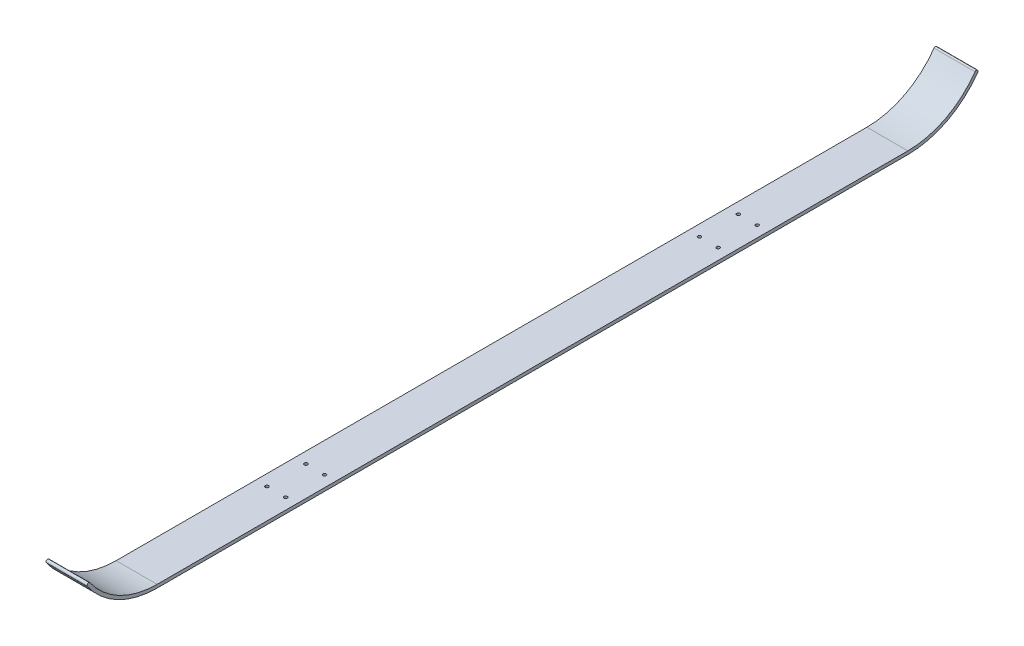
ISO-10303-21;
HEADER;
FILE_DESCRIPTION(('STEP AP214'),'2;1');
FILE_NAME('part.step','',(''),(''),'','','');
FILE_SCHEMA(('AUTOMOTIVE_DESIGN { 1 0 10303 214 1 1 1 1 }'));
ENDSEC;
DATA;
#1=APPLICATION_CONTEXT('core data for automotive mechanical design processes');
#2=APPLICATION_PROTOCOL_DEFINITION('international standard','automotive_design',2000,#1);
#3=PRODUCT_CONTEXT('',#1,'mechanical');
#4=PRODUCT('Part','Part','',(#3));
#5=PRODUCT_RELATED_PRODUCT_CATEGORY('part','',(#4));
#6=PRODUCT_DEFINITION_FORMATION('','',#4);
#7=PRODUCT_DEFINITION_CONTEXT('part definition',#1,'design');
#8=PRODUCT_DEFINITION('design','',#6,#7);
#9=PRODUCT_DEFINITION_SHAPE('','',#8);
#10=(LENGTH_UNIT() NAMED_UNIT(*) SI_UNIT(.MILLI.,.METRE.));
#11=(NAMED_UNIT(*) PLANE_ANGLE_UNIT() SI_UNIT($,.RADIAN.));
#12=(NAMED_UNIT(*) SI_UNIT($,.STERADIAN.) SOLID_ANGLE_UNIT());
#13=UNCERTAINTY_MEASURE_WITH_UNIT(LENGTH_MEASURE(1.E-05),#10,'distance_accuracy_value','');
#14=(GEOMETRIC_REPRESENTATION_CONTEXT(3) GLOBAL_UNCERTAINTY_ASSIGNED_CONTEXT((#13)) GLOBAL_UNIT_ASSIGNED_CONTEXT((#10,
#11,#12)) REPRESENTATION_CONTEXT('',''));
#15=CARTESIAN_POINT('',(0.,0.,0.));
#16=DIRECTION('',(0.,0.,1.));
#17=DIRECTION('',(1.,0.,0.));
#18=AXIS2_PLACEMENT_3D('',#15,#16,#17);
#19=CARTESIAN_POINT('',(0.,12.,0.));
#20=DIRECTION('',(0.,-1.,0.));
#21=DIRECTION('',(0.,0.,-1.));
#22=AXIS2_PLACEMENT_3D('',#19,#20,#21);
#23=PLANE('',#22);
#24=DIRECTION('',(0.,0.,-1.));
#25=VECTOR('',#24,1.);
#26=CARTESIAN_POINT('',(75.,12.,1274.));
#27=LINE('',#26,#25);
#28=CARTESIAN_POINT('',(75.,12.,1374.));
#29=VERTEX_POINT('',#28);
#30=CARTESIAN_POINT('',(75.,12.,-1374.));
#31=VERTEX_POINT('',#30);
#32=EDGE_CURVE('E41',#29,#31,#27,.T.);
#33=ORIENTED_EDGE('',*,*,#32,.T.);
#34=DIRECTION('',(1.,0.,0.));
#35=VECTOR('',#34,1.);
#36=CARTESIAN_POINT('',(-459.068847578424,12.,-1374.));
#37=LINE('',#36,#35);
#38=CARTESIAN_POINT('',(-75.,12.,-1374.));
#39=VERTEX_POINT('',#38);
#40=EDGE_CURVE('E108',#39,#31,#37,.T.);
#41=ORIENTED_EDGE('',*,*,#40,.F.);
#42=DIRECTION('',(0.,0.,1.));
#43=VECTOR('',#42,1.);
#44=CARTESIAN_POINT('',(-75.,12.,1274.));
#45=LINE('',#44,#43);
#46=CARTESIAN_POINT('',(-75.,12.,1374.));
#47=VERTEX_POINT('',#46);
#48=EDGE_CURVE('E11',#39,#47,#45,.T.);
#49=ORIENTED_EDGE('',*,*,#48,.T.);
#50=DIRECTION('',(1.,0.,0.));
#51=VECTOR('',#50,1.);
#52=CARTESIAN_POINT('',(-459.068847578424,12.,1374.));
#53=LINE('',#52,#51);
#54=EDGE_CURVE('E148',#47,#29,#53,.T.);
#55=ORIENTED_EDGE('',*,*,#54,.T.);
#56=EDGE_LOOP('',(#33,#41,#49,#55));
#57=FACE_BOUND('',#56,.T.);
#58=CARTESIAN_POINT('',(-34.2499999999996,12.,-720.25));
#59=DIRECTION('',(0.,1.,0.));
#60=DIRECTION('',(0.,0.,1.));
#61=AXIS2_PLACEMENT_3D('',#58,#59,#60);
#62=CIRCLE('',#61,6.);
#63=CARTESIAN_POINT('',(-34.2499999999996,12.,-714.25));
#64=VERTEX_POINT('',#63);
#65=EDGE_CURVE('E199',#64,#64,#62,.T.);
#66=ORIENTED_EDGE('',*,*,#65,.F.);
#67=EDGE_LOOP('',(#66));
#68=FACE_BOUND('',#67,.T.);
#69=CARTESIAN_POINT('',(34.2500000000004,12.,-720.25));
#70=DIRECTION('',(0.,1.,0.));
#71=DIRECTION('',(0.,0.,1.));
#72=AXIS2_PLACEMENT_3D('',#69,#70,#71);
#73=CIRCLE('',#72,6.);
#74=CARTESIAN_POINT('',(34.2500000000004,12.,-714.25));
#75=VERTEX_POINT('',#74);
#76=EDGE_CURVE('E193',#75,#75,#73,.T.);
#77=ORIENTED_EDGE('',*,*,#76,.F.);
#78=EDGE_LOOP('',(#77));
#79=FACE_BOUND('',#78,.T.);
#80=CARTESIAN_POINT('',(-34.2499999999996,12.,-862.75));
#81=DIRECTION('',(0.,1.,0.));
#82=DIRECTION('',(0.,0.,1.));
#83=AXIS2_PLACEMENT_3D('',#80,#81,#82);
#84=CIRCLE('',#83,6.);
#85=CARTESIAN_POINT('',(-34.2499999999996,12.,-856.75));
#86=VERTEX_POINT('',#85);
#87=EDGE_CURVE('E187',#86,#86,#84,.T.);
#88=ORIENTED_EDGE('',*,*,#87,.F.);
#89=EDGE_LOOP('',(#88));
#90=FACE_BOUND('',#89,.T.);
#91=CARTESIAN_POINT('',(34.2500000000004,12.,-862.75));
#92=DIRECTION('',(0.,1.,0.));
#93=DIRECTION('',(0.,0.,1.));
#94=AXIS2_PLACEMENT_3D('',#91,#92,#93);
#95=CIRCLE('',#94,6.);
#96=CARTESIAN_POINT('',(34.2500000000004,12.,-856.75));
#97=VERTEX_POINT('',#96);
#98=EDGE_CURVE('E181',#97,#97,#95,.T.);
#99=ORIENTED_EDGE('',*,*,#98,.F.);
#100=EDGE_LOOP('',(#99));
#101=FACE_BOUND('',#100,.T.);
#102=CARTESIAN_POINT('',(34.2500000000004,12.,720.25));
#103=DIRECTION('',(0.,1.,0.));
#104=DIRECTION('',(0.,0.,-1.));
#105=AXIS2_PLACEMENT_3D('',#102,#103,#104);
#106=CIRCLE('',#105,6.);
#107=CARTESIAN_POINT('',(34.2500000000004,12.,714.25));
#108=VERTEX_POINT('',#107);
#109=EDGE_CURVE('E175',#108,#108,#106,.T.);
#110=ORIENTED_EDGE('',*,*,#109,.F.);
#111=EDGE_LOOP('',(#110));
#112=FACE_BOUND('',#111,.T.);
#113=CARTESIAN_POINT('',(-34.2499999999996,12.,720.25));
#114=DIRECTION('',(0.,1.,0.));
#115=DIRECTION('',(0.,0.,-1.));
#116=AXIS2_PLACEMENT_3D('',#113,#114,#115);
#117=CIRCLE('',#116,6.);
#118=CARTESIAN_POINT('',(-34.2499999999996,12.,714.25));
#119=VERTEX_POINT('',#118);
#120=EDGE_CURVE('E169',#119,#119,#117,.T.);
#121=ORIENTED_EDGE('',*,*,#120,.F.);
#122=EDGE_LOOP('',(#121));
#123=FACE_BOUND('',#122,.T.);
#124=CARTESIAN_POINT('',(34.2500000000004,12.,862.75));
#125=DIRECTION('',(0.,1.,0.));
#126=DIRECTION('',(0.,0.,-1.));
#127=AXIS2_PLACEMENT_3D('',#124,#125,#126);
#128=CIRCLE('',#127,6.);
#129=CARTESIAN_POINT('',(34.2500000000004,12.,856.75));
#130=VERTEX_POINT('',#129);
#131=EDGE_CURVE('E163',#130,#130,#128,.T.);
#132=ORIENTED_EDGE('',*,*,#131,.F.);
#133=EDGE_LOOP('',(#132));
#134=FACE_BOUND('',#133,.T.);
#135=CARTESIAN_POINT('',(-34.2499999999996,12.,862.75));
#136=DIRECTION('',(0.,1.,0.));
#137=DIRECTION('',(0.,0.,-1.));
#138=AXIS2_PLACEMENT_3D('',#135,#136,#137);
#139=CIRCLE('',#138,6.);
#140=CARTESIAN_POINT('',(-34.2499999999996,12.,856.75));
#141=VERTEX_POINT('',#140);
#142=EDGE_CURVE('E157',#141,#141,#139,.T.);
#143=ORIENTED_EDGE('',*,*,#142,.F.);
#144=EDGE_LOOP('',(#143));
#145=FACE_BOUND('',#144,.T.);
#146=ADVANCED_FACE('F32',(#57,#68,#79,#90,#101,#112,#123,#134,#145),#23,.F.);
#147=CARTESIAN_POINT('',(0.,0.,0.));
#148=DIRECTION('',(0.,-1.,0.));
#149=DIRECTION('',(0.,0.,-1.));
#150=AXIS2_PLACEMENT_3D('',#147,#148,#149);
#151=PLANE('',#150);
#152=CARTESIAN_POINT('',(34.2500000000004,0.,862.75));
#153=DIRECTION('',(0.,1.,0.));
#154=DIRECTION('',(0.,0.,-1.));
#155=AXIS2_PLACEMENT_3D('',#152,#153,#154);
#156=CIRCLE('',#155,6.);
#157=CARTESIAN_POINT('',(34.2500000000004,0.,856.75));
#158=VERTEX_POINT('',#157);
#159=EDGE_CURVE('E160',#158,#158,#156,.T.);
#160=ORIENTED_EDGE('',*,*,#159,.T.);
#161=EDGE_LOOP('',(#160));
#162=FACE_BOUND('',#161,.T.);
#163=CARTESIAN_POINT('',(34.2500000000004,0.,720.25));
#164=DIRECTION('',(0.,1.,0.));
#165=DIRECTION('',(0.,0.,-1.));
#166=AXIS2_PLACEMENT_3D('',#163,#164,#165);
#167=CIRCLE('',#166,6.);
#168=CARTESIAN_POINT('',(34.2500000000004,0.,714.25));
#169=VERTEX_POINT('',#168);
#170=EDGE_CURVE('E172',#169,#169,#167,.T.);
#171=ORIENTED_EDGE('',*,*,#170,.T.);
#172=EDGE_LOOP('',(#171));
#173=FACE_BOUND('',#172,.T.);
#174=CARTESIAN_POINT('',(-34.2499999999996,0.,-862.75));
#175=DIRECTION('',(0.,1.,0.));
#176=DIRECTION('',(0.,0.,1.));
#177=AXIS2_PLACEMENT_3D('',#174,#175,#176);
#178=CIRCLE('',#177,6.);
#179=CARTESIAN_POINT('',(-34.2499999999996,0.,-856.75));
#180=VERTEX_POINT('',#179);
#181=EDGE_CURVE('E184',#180,#180,#178,.T.);
#182=ORIENTED_EDGE('',*,*,#181,.T.);
#183=EDGE_LOOP('',(#182));
#184=FACE_BOUND('',#183,.T.);
#185=CARTESIAN_POINT('',(-34.2499999999996,0.,-720.25));
#186=DIRECTION('',(0.,1.,0.));
#187=DIRECTION('',(0.,0.,1.));
#188=AXIS2_PLACEMENT_3D('',#185,#186,#187);
#189=CIRCLE('',#188,6.);
#190=CARTESIAN_POINT('',(-34.2499999999996,0.,-714.25));
#191=VERTEX_POINT('',#190);
#192=EDGE_CURVE('E196',#191,#191,#189,.T.);
#193=ORIENTED_EDGE('',*,*,#192,.T.);
#194=EDGE_LOOP('',(#193));
#195=FACE_BOUND('',#194,.T.);
#196=DIRECTION('',(0.,0.,-1.));
#197=VECTOR('',#196,1.);
#198=CARTESIAN_POINT('',(75.,0.,1274.));
#199=LINE('',#198,#197);
#200=CARTESIAN_POINT('',(75.,0.,1374.));
#201=VERTEX_POINT('',#200);
#202=CARTESIAN_POINT('',(75.,0.,-1374.));
#203=VERTEX_POINT('',#202);
#204=EDGE_CURVE('E202',#201,#203,#199,.T.);
#205=ORIENTED_EDGE('',*,*,#204,.F.);
#206=DIRECTION('',(1.,0.,0.));
#207=VECTOR('',#206,1.);
#208=CARTESIAN_POINT('',(-459.068847578424,0.,1374.));
#209=LINE('',#208,#207);
#210=CARTESIAN_POINT('',(-75.,0.,1374.));
#211=VERTEX_POINT('',#210);
#212=EDGE_CURVE('E136',#211,#201,#209,.T.);
#213=ORIENTED_EDGE('',*,*,#212,.F.);
#214=DIRECTION('',(0.,0.,1.));
#215=VECTOR('',#214,1.);
#216=CARTESIAN_POINT('',(-75.,0.,1274.));
#217=LINE('',#216,#215);
#218=CARTESIAN_POINT('',(-75.,0.,-1374.));
#219=VERTEX_POINT('',#218);
#220=EDGE_CURVE('E36',#219,#211,#217,.T.);
#221=ORIENTED_EDGE('',*,*,#220,.F.);
#222=DIRECTION('',(1.,0.,0.));
#223=VECTOR('',#222,1.);
#224=CARTESIAN_POINT('',(-459.068847578424,0.,-1374.));
#225=LINE('',#224,#223);
#226=EDGE_CURVE('E127',#219,#203,#225,.T.);
#227=ORIENTED_EDGE('',*,*,#226,.T.);
#228=EDGE_LOOP('',(#205,#213,#221,#227));
#229=FACE_BOUND('',#228,.T.);
#230=CARTESIAN_POINT('',(34.2500000000004,0.,-720.25));
#231=DIRECTION('',(0.,1.,0.));
#232=DIRECTION('',(0.,0.,1.));
#233=AXIS2_PLACEMENT_3D('',#230,#231,#232);
#234=CIRCLE('',#233,6.);
#235=CARTESIAN_POINT('',(34.2500000000004,0.,-714.25));
#236=VERTEX_POINT('',#235);
#237=EDGE_CURVE('E190',#236,#236,#234,.T.);
#238=ORIENTED_EDGE('',*,*,#237,.T.);
#239=EDGE_LOOP('',(#238));
#240=FACE_BOUND('',#239,.T.);
#241=CARTESIAN_POINT('',(34.2500000000004,0.,-862.75));
#242=DIRECTION('',(0.,1.,0.));
#243=DIRECTION('',(0.,0.,1.));
#244=AXIS2_PLACEMENT_3D('',#241,#242,#243);
#245=CIRCLE('',#244,6.);
#246=CARTESIAN_POINT('',(34.2500000000004,0.,-856.75));
#247=VERTEX_POINT('',#246);
#248=EDGE_CURVE('E178',#247,#247,#245,.T.);
#249=ORIENTED_EDGE('',*,*,#248,.T.);
#250=EDGE_LOOP('',(#249));
#251=FACE_BOUND('',#250,.T.);
#252=CARTESIAN_POINT('',(-34.2499999999996,0.,720.25));
#253=DIRECTION('',(0.,1.,0.));
#254=DIRECTION('',(0.,0.,-1.));
#255=AXIS2_PLACEMENT_3D('',#252,#253,#254);
#256=CIRCLE('',#255,6.);
#257=CARTESIAN_POINT('',(-34.2499999999996,0.,714.25));
#258=VERTEX_POINT('',#257);
#259=EDGE_CURVE('E166',#258,#258,#256,.T.);
#260=ORIENTED_EDGE('',*,*,#259,.T.);
#261=EDGE_LOOP('',(#260));
#262=FACE_BOUND('',#261,.T.);
#263=CARTESIAN_POINT('',(-34.2499999999996,0.,862.75));
#264=DIRECTION('',(0.,1.,0.));
#265=DIRECTION('',(0.,0.,-1.));
#266=AXIS2_PLACEMENT_3D('',#263,#264,#265);
#267=CIRCLE('',#266,6.);
#268=CARTESIAN_POINT('',(-34.2499999999996,0.,856.75));
#269=VERTEX_POINT('',#268);
#270=EDGE_CURVE('E139',#269,#269,#267,.T.);
#271=ORIENTED_EDGE('',*,*,#270,.T.);
#272=EDGE_LOOP('',(#271));
#273=FACE_BOUND('',#272,.T.);
#274=ADVANCED_FACE('F215',(#162,#173,#184,#195,#229,#240,#251,#262,#273),#151,.T.);
#275=CARTESIAN_POINT('',(75.,12.,1274.));
#276=DIRECTION('',(-1.,0.,0.));
#277=DIRECTION('',(0.,0.,1.));
#278=AXIS2_PLACEMENT_3D('',#275,#276,#277);
#279=PLANE('',#278);
#280=ORIENTED_EDGE('',*,*,#204,.T.);
#281=CARTESIAN_POINT('',(75.,312.,-1374.));
#282=DIRECTION('',(1.,0.,0.));
#283=DIRECTION('',(0.,0.,1.));
#284=AXIS2_PLACEMENT_3D('',#281,#282,#283);
#285=CIRCLE('',#284,312.);
#286=CARTESIAN_POINT('',(75.,133.044151858472,-1629.57543781816));
#287=VERTEX_POINT('',#286);
#288=EDGE_CURVE('E109',#203,#287,#285,.T.);
#289=ORIENTED_EDGE('',*,*,#288,.T.);
#290=CARTESIAN_POINT('',(75.,136.485610476578,-1624.66052555243));
#291=DIRECTION('',(1.,0.,0.));
#292=DIRECTION('',(0.,0.,1.));
#293=AXIS2_PLACEMENT_3D('',#290,#291,#292);
#294=CIRCLE('',#293,5.99999999999999);
#295=CARTESIAN_POINT('',(75.,139.927069094684,-1619.7456132867));
#296=VERTEX_POINT('',#295);
#297=EDGE_CURVE('E103',#287,#296,#294,.T.);
#298=ORIENTED_EDGE('',*,*,#297,.T.);
#299=CARTESIAN_POINT('',(75.,312.,-1374.));
#300=DIRECTION('',(-1.,0.,0.));
#301=DIRECTION('',(0.,0.,1.));
#302=AXIS2_PLACEMENT_3D('',#299,#300,#301);
#303=CIRCLE('',#302,300.);
#304=EDGE_CURVE('E113',#296,#31,#303,.T.);
#305=ORIENTED_EDGE('',*,*,#304,.T.);
#306=ORIENTED_EDGE('',*,*,#32,.F.);
#307=CARTESIAN_POINT('',(75.,312.,1374.));
#308=DIRECTION('',(-1.,0.,0.));
#309=DIRECTION('',(0.,0.,-1.));
#310=AXIS2_PLACEMENT_3D('',#307,#308,#309);
#311=CIRCLE('',#310,300.);
#312=CARTESIAN_POINT('',(75.,139.927069094684,1619.7456132867));
#313=VERTEX_POINT('',#312);
#314=EDGE_CURVE('E133',#29,#313,#311,.T.);
#315=ORIENTED_EDGE('',*,*,#314,.T.);
#316=CARTESIAN_POINT('',(75.,136.485610476578,1624.66052555243));
#317=DIRECTION('',(1.,0.,0.));
#318=DIRECTION('',(0.,0.,-1.));
#319=AXIS2_PLACEMENT_3D('',#316,#317,#318);
#320=CIRCLE('',#319,5.99999999999999);
#321=CARTESIAN_POINT('',(75.,133.044151858472,1629.57543781816));
#322=VERTEX_POINT('',#321);
#323=EDGE_CURVE('E142',#313,#322,#320,.T.);
#324=ORIENTED_EDGE('',*,*,#323,.T.);
#325=CARTESIAN_POINT('',(75.,312.,1374.));
#326=DIRECTION('',(1.,0.,0.));
#327=DIRECTION('',(0.,0.,-1.));
#328=AXIS2_PLACEMENT_3D('',#325,#326,#327);
#329=CIRCLE('',#328,312.);
#330=EDGE_CURVE('E145',#322,#201,#329,.T.);
#331=ORIENTED_EDGE('',*,*,#330,.T.);
#332=EDGE_LOOP('',(#280,#289,#298,#305,#306,#315,#324,#331));
#333=FACE_BOUND('',#332,.T.);
#334=ADVANCED_FACE('F34',(#333),#279,.F.);
#335=CARTESIAN_POINT('',(-75.,12.,1274.));
#336=DIRECTION('',(1.,0.,0.));
#337=DIRECTION('',(0.,0.,-1.));
#338=AXIS2_PLACEMENT_3D('',#335,#336,#337);
#339=PLANE('',#338);
#340=ORIENTED_EDGE('',*,*,#220,.T.);
#341=CARTESIAN_POINT('',(-75.,312.,1374.));
#342=DIRECTION('',(1.,0.,0.));
#343=DIRECTION('',(0.,0.,-1.));
#344=AXIS2_PLACEMENT_3D('',#341,#342,#343);
#345=CIRCLE('',#344,312.);
#346=CARTESIAN_POINT('',(-75.,133.044151858472,1629.57543781816));
#347=VERTEX_POINT('',#346);
#348=EDGE_CURVE('E54',#211,#347,#345,.F.);
#349=ORIENTED_EDGE('',*,*,#348,.T.);
#350=CARTESIAN_POINT('',(-75.,136.485610476578,1624.66052555243));
#351=DIRECTION('',(1.,0.,0.));
#352=DIRECTION('',(0.,0.,-1.));
#353=AXIS2_PLACEMENT_3D('',#350,#351,#352);
#354=CIRCLE('',#353,5.99999999999999);
#355=CARTESIAN_POINT('',(-75.,139.927069094684,1619.7456132867));
#356=VERTEX_POINT('',#355);
#357=EDGE_CURVE('E49',#347,#356,#354,.F.);
#358=ORIENTED_EDGE('',*,*,#357,.T.);
#359=CARTESIAN_POINT('',(-75.,312.,1374.));
#360=DIRECTION('',(1.,0.,0.));
#361=DIRECTION('',(0.,0.,-1.));
#362=AXIS2_PLACEMENT_3D('',#359,#360,#361);
#363=CIRCLE('',#362,300.);
#364=EDGE_CURVE('E134',#356,#47,#363,.T.);
#365=ORIENTED_EDGE('',*,*,#364,.T.);
#366=ORIENTED_EDGE('',*,*,#48,.F.);
#367=CARTESIAN_POINT('',(-75.,312.,-1374.));
#368=DIRECTION('',(1.,0.,0.));
#369=DIRECTION('',(0.,0.,-1.));
#370=AXIS2_PLACEMENT_3D('',#367,#368,#369);
#371=CIRCLE('',#370,300.);
#372=CARTESIAN_POINT('',(-75.,139.927069094684,-1619.7456132867));
#373=VERTEX_POINT('',#372);
#374=EDGE_CURVE('E131',#39,#373,#371,.T.);
#375=ORIENTED_EDGE('',*,*,#374,.T.);
#376=CARTESIAN_POINT('',(-75.,136.485610476578,-1624.66052555243));
#377=DIRECTION('',(1.,0.,0.));
#378=DIRECTION('',(0.,0.,-1.));
#379=AXIS2_PLACEMENT_3D('',#376,#377,#378);
#380=CIRCLE('',#379,5.99999999999999);
#381=CARTESIAN_POINT('',(-75.,133.044151858472,-1629.57543781816));
#382=VERTEX_POINT('',#381);
#383=EDGE_CURVE('E105',#373,#382,#380,.F.);
#384=ORIENTED_EDGE('',*,*,#383,.T.);
#385=CARTESIAN_POINT('',(-75.,312.,-1374.));
#386=DIRECTION('',(1.,0.,0.));
#387=DIRECTION('',(0.,0.,-1.));
#388=AXIS2_PLACEMENT_3D('',#385,#386,#387);
#389=CIRCLE('',#388,312.);
#390=EDGE_CURVE('E126',#382,#219,#389,.F.);
#391=ORIENTED_EDGE('',*,*,#390,.T.);
#392=EDGE_LOOP('',(#340,#349,#358,#365,#366,#375,#384,#391));
#393=FACE_BOUND('',#392,.T.);
#394=ADVANCED_FACE('F206',(#393),#339,.F.);
#395=CARTESIAN_POINT('',(-34.2499999999996,12.,-720.25));
#396=DIRECTION('',(0.,-1.,0.));
#397=DIRECTION('',(0.,0.,-1.));
#398=AXIS2_PLACEMENT_3D('',#395,#396,#397);
#399=CYLINDRICAL_SURFACE('',#398,6.);
#400=ORIENTED_EDGE('',*,*,#65,.T.);
#401=EDGE_LOOP('',(#400));
#402=FACE_BOUND('',#401,.T.);
#403=ORIENTED_EDGE('',*,*,#192,.F.);
#404=EDGE_LOOP('',(#403));
#405=FACE_BOUND('',#404,.T.);
#406=ADVANCED_FACE('F246',(#402,#405),#399,.F.);
#407=CARTESIAN_POINT('',(34.2500000000004,12.,-720.25));
#408=DIRECTION('',(0.,-1.,0.));
#409=DIRECTION('',(0.,0.,-1.));
#410=AXIS2_PLACEMENT_3D('',#407,#408,#409);
#411=CYLINDRICAL_SURFACE('',#410,6.);
#412=ORIENTED_EDGE('',*,*,#76,.T.);
#413=EDGE_LOOP('',(#412));
#414=FACE_BOUND('',#413,.T.);
#415=ORIENTED_EDGE('',*,*,#237,.F.);
#416=EDGE_LOOP('',(#415));
#417=FACE_BOUND('',#416,.T.);
#418=ADVANCED_FACE('F253',(#414,#417),#411,.F.);
#419=CARTESIAN_POINT('',(-34.2499999999996,12.,-862.75));
#420=DIRECTION('',(0.,-1.,0.));
#421=DIRECTION('',(0.,0.,-1.));
#422=AXIS2_PLACEMENT_3D('',#419,#420,#421);
#423=CYLINDRICAL_SURFACE('',#422,6.);
#424=ORIENTED_EDGE('',*,*,#87,.T.);
#425=EDGE_LOOP('',(#424));
#426=FACE_BOUND('',#425,.T.);
#427=ORIENTED_EDGE('',*,*,#181,.F.);
#428=EDGE_LOOP('',(#427));
#429=FACE_BOUND('',#428,.T.);
#430=ADVANCED_FACE('F317',(#426,#429),#423,.F.);
#431=CARTESIAN_POINT('',(34.2500000000004,12.,-862.75));
#432=DIRECTION('',(0.,-1.,0.));
#433=DIRECTION('',(0.,0.,-1.));
#434=AXIS2_PLACEMENT_3D('',#431,#432,#433);
#435=CYLINDRICAL_SURFACE('',#434,6.);
#436=ORIENTED_EDGE('',*,*,#98,.T.);
#437=EDGE_LOOP('',(#436));
#438=FACE_BOUND('',#437,.T.);
#439=ORIENTED_EDGE('',*,*,#248,.F.);
#440=EDGE_LOOP('',(#439));
#441=FACE_BOUND('',#440,.T.);
#442=ADVANCED_FACE('F307',(#438,#441),#435,.F.);
#443=CARTESIAN_POINT('',(34.2500000000004,12.,720.25));
#444=DIRECTION('',(0.,-1.,0.));
#445=DIRECTION('',(0.,0.,-1.));
#446=AXIS2_PLACEMENT_3D('',#443,#444,#445);
#447=CYLINDRICAL_SURFACE('',#446,6.);
#448=ORIENTED_EDGE('',*,*,#109,.T.);
#449=EDGE_LOOP('',(#448));
#450=FACE_BOUND('',#449,.T.);
#451=ORIENTED_EDGE('',*,*,#170,.F.);
#452=EDGE_LOOP('',(#451));
#453=FACE_BOUND('',#452,.T.);
#454=ADVANCED_FACE('F297',(#450,#453),#447,.F.);
#455=CARTESIAN_POINT('',(-34.2499999999996,12.,720.25));
#456=DIRECTION('',(0.,-1.,0.));
#457=DIRECTION('',(0.,0.,-1.));
#458=AXIS2_PLACEMENT_3D('',#455,#456,#457);
#459=CYLINDRICAL_SURFACE('',#458,6.);
#460=ORIENTED_EDGE('',*,*,#120,.T.);
#461=EDGE_LOOP('',(#460));
#462=FACE_BOUND('',#461,.T.);
#463=ORIENTED_EDGE('',*,*,#259,.F.);
#464=EDGE_LOOP('',(#463));
#465=FACE_BOUND('',#464,.T.);
#466=ADVANCED_FACE('F287',(#462,#465),#459,.F.);
#467=CARTESIAN_POINT('',(34.2500000000004,12.,862.75));
#468=DIRECTION('',(0.,-1.,0.));
#469=DIRECTION('',(0.,0.,-1.));
#470=AXIS2_PLACEMENT_3D('',#467,#468,#469);
#471=CYLINDRICAL_SURFACE('',#470,6.);
#472=ORIENTED_EDGE('',*,*,#131,.T.);
#473=EDGE_LOOP('',(#472));
#474=FACE_BOUND('',#473,.T.);
#475=ORIENTED_EDGE('',*,*,#159,.F.);
#476=EDGE_LOOP('',(#475));
#477=FACE_BOUND('',#476,.T.);
#478=ADVANCED_FACE('F277',(#474,#477),#471,.F.);
#479=CARTESIAN_POINT('',(-34.2499999999996,12.,862.75));
#480=DIRECTION('',(0.,-1.,0.));
#481=DIRECTION('',(0.,0.,-1.));
#482=AXIS2_PLACEMENT_3D('',#479,#480,#481);
#483=CYLINDRICAL_SURFACE('',#482,6.);
#484=ORIENTED_EDGE('',*,*,#142,.T.);
#485=EDGE_LOOP('',(#484));
#486=FACE_BOUND('',#485,.T.);
#487=ORIENTED_EDGE('',*,*,#270,.F.);
#488=EDGE_LOOP('',(#487));
#489=FACE_BOUND('',#488,.T.);
#490=ADVANCED_FACE('F236',(#486,#489),#483,.F.);
#491=CARTESIAN_POINT('',(-459.068847578424,312.,1374.));
#492=DIRECTION('',(1.,0.,0.));
#493=DIRECTION('',(0.,0.,-1.));
#494=AXIS2_PLACEMENT_3D('',#491,#492,#493);
#495=CYLINDRICAL_SURFACE('',#494,312.);
#496=ORIENTED_EDGE('',*,*,#348,.F.);
#497=ORIENTED_EDGE('',*,*,#212,.T.);
#498=ORIENTED_EDGE('',*,*,#330,.F.);
#499=DIRECTION('',(1.,0.,0.));
#500=VECTOR('',#499,1.);
#501=CARTESIAN_POINT('',(-459.068847578424,133.044151858472,1629.57543781816));
#502=LINE('',#501,#500);
#503=EDGE_CURVE('E151',#347,#322,#502,.T.);
#504=ORIENTED_EDGE('',*,*,#503,.F.);
#505=EDGE_LOOP('',(#496,#497,#498,#504));
#506=FACE_BOUND('',#505,.T.);
#507=ADVANCED_FACE('F213',(#506),#495,.T.);
#508=CARTESIAN_POINT('',(-459.068847578424,136.485610476578,1624.66052555243));
#509=DIRECTION('',(1.,0.,0.));
#510=DIRECTION('',(0.,0.,-1.));
#511=AXIS2_PLACEMENT_3D('',#508,#509,#510);
#512=CYLINDRICAL_SURFACE('',#511,5.99999999999999);
#513=ORIENTED_EDGE('',*,*,#357,.F.);
#514=ORIENTED_EDGE('',*,*,#503,.T.);
#515=ORIENTED_EDGE('',*,*,#323,.F.);
#516=DIRECTION('',(1.,0.,0.));
#517=VECTOR('',#516,1.);
#518=CARTESIAN_POINT('',(-459.068847578424,139.927069094684,1619.7456132867));
#519=LINE('',#518,#517);
#520=EDGE_CURVE('E153',#356,#313,#519,.T.);
#521=ORIENTED_EDGE('',*,*,#520,.F.);
#522=EDGE_LOOP('',(#513,#514,#515,#521));
#523=FACE_BOUND('',#522,.T.);
#524=ADVANCED_FACE('F228',(#523),#512,.T.);
#525=CARTESIAN_POINT('',(-459.068847578424,312.,1374.));
#526=DIRECTION('',(1.,0.,0.));
#527=DIRECTION('',(0.,0.,-1.));
#528=AXIS2_PLACEMENT_3D('',#525,#526,#527);
#529=CYLINDRICAL_SURFACE('',#528,300.);
#530=ORIENTED_EDGE('',*,*,#364,.F.);
#531=ORIENTED_EDGE('',*,*,#520,.T.);
#532=ORIENTED_EDGE('',*,*,#314,.F.);
#533=ORIENTED_EDGE('',*,*,#54,.F.);
#534=EDGE_LOOP('',(#530,#531,#532,#533));
#535=FACE_BOUND('',#534,.T.);
#536=ADVANCED_FACE('F225',(#535),#529,.F.);
#537=CARTESIAN_POINT('',(-459.068847578424,136.485610476578,-1624.66052555243));
#538=DIRECTION('',(1.,0.,0.));
#539=DIRECTION('',(0.,0.,-1.));
#540=AXIS2_PLACEMENT_3D('',#537,#538,#539);
#541=CYLINDRICAL_SURFACE('',#540,5.99999999999999);
#542=ORIENTED_EDGE('',*,*,#383,.F.);
#543=DIRECTION('',(1.,0.,0.));
#544=VECTOR('',#543,1.);
#545=CARTESIAN_POINT('',(-459.068847578424,139.927069094684,-1619.7456132867));
#546=LINE('',#545,#544);
#547=EDGE_CURVE('E98',#373,#296,#546,.T.);
#548=ORIENTED_EDGE('',*,*,#547,.T.);
#549=ORIENTED_EDGE('',*,*,#297,.F.);
#550=DIRECTION('',(1.,0.,0.));
#551=VECTOR('',#550,1.);
#552=CARTESIAN_POINT('',(-459.068847578424,133.044151858472,-1629.57543781816));
#553=LINE('',#552,#551);
#554=EDGE_CURVE('E124',#382,#287,#553,.T.);
#555=ORIENTED_EDGE('',*,*,#554,.F.);
#556=EDGE_LOOP('',(#542,#548,#549,#555));
#557=FACE_BOUND('',#556,.T.);
#558=ADVANCED_FACE('F100',(#557),#541,.T.);
#559=CARTESIAN_POINT('',(-459.068847578424,312.,-1374.));
#560=DIRECTION('',(1.,0.,0.));
#561=DIRECTION('',(0.,0.,-1.));
#562=AXIS2_PLACEMENT_3D('',#559,#560,#561);
#563=CYLINDRICAL_SURFACE('',#562,312.);
#564=ORIENTED_EDGE('',*,*,#390,.F.);
#565=ORIENTED_EDGE('',*,*,#554,.T.);
#566=ORIENTED_EDGE('',*,*,#288,.F.);
#567=ORIENTED_EDGE('',*,*,#226,.F.);
#568=EDGE_LOOP('',(#564,#565,#566,#567));
#569=FACE_BOUND('',#568,.T.);
#570=ADVANCED_FACE('F218',(#569),#563,.T.);
#571=CARTESIAN_POINT('',(-459.068847578424,312.,-1374.));
#572=DIRECTION('',(1.,0.,0.));
#573=DIRECTION('',(0.,0.,-1.));
#574=AXIS2_PLACEMENT_3D('',#571,#572,#573);
#575=CYLINDRICAL_SURFACE('',#574,300.);
#576=ORIENTED_EDGE('',*,*,#374,.F.);
#577=ORIENTED_EDGE('',*,*,#40,.T.);
#578=ORIENTED_EDGE('',*,*,#304,.F.);
#579=ORIENTED_EDGE('',*,*,#547,.F.);
#580=EDGE_LOOP('',(#576,#577,#578,#579));
#581=FACE_BOUND('',#580,.T.);
#582=ADVANCED_FACE('F114',(#581),#575,.F.);
#583=CLOSED_SHELL('',(#146,#274,#334,#394,#406,#418,#430,#442,#454,#466,#478,#490,#507,#524,
#536,#558,#570,#582));
#584=MANIFOLD_SOLID_BREP('B2',#583);
#585=ADVANCED_BREP_SHAPE_REPRESENTATION('',(#18,#584),#14);
#586=SHAPE_DEFINITION_REPRESENTATION(#9,#585);
ENDSEC;
END-ISO-10303-21;
